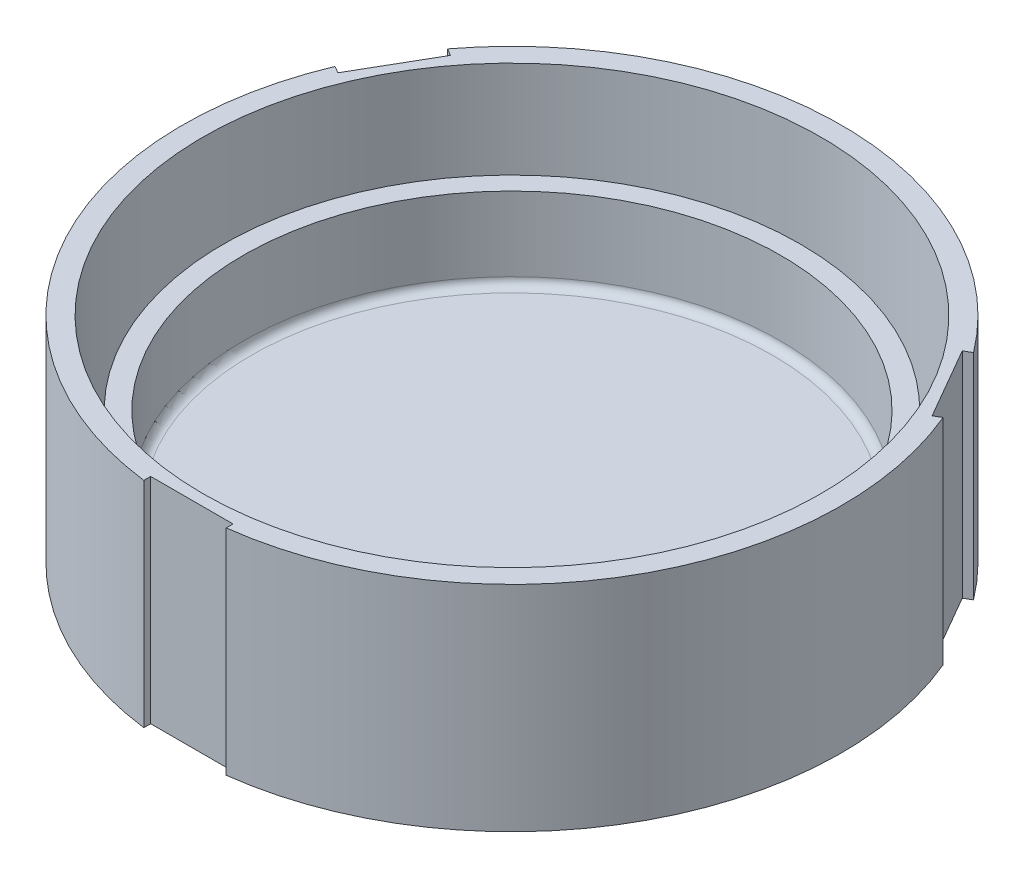
ISO-10303-21;
HEADER;
FILE_DESCRIPTION(('STEP AP214'),'2;1');
FILE_NAME('part.step','',(''),(''),'','','');
FILE_SCHEMA(('AUTOMOTIVE_DESIGN { 1 0 10303 214 1 1 1 1 }'));
ENDSEC;
DATA;
#1=APPLICATION_CONTEXT('core data for automotive mechanical design processes');
#2=APPLICATION_PROTOCOL_DEFINITION('international standard','automotive_design',2000,#1);
#3=PRODUCT_CONTEXT('',#1,'mechanical');
#4=PRODUCT('Part','Part','',(#3));
#5=PRODUCT_RELATED_PRODUCT_CATEGORY('part','',(#4));
#6=PRODUCT_DEFINITION_FORMATION('','',#4);
#7=PRODUCT_DEFINITION_CONTEXT('part definition',#1,'design');
#8=PRODUCT_DEFINITION('design','',#6,#7);
#9=PRODUCT_DEFINITION_SHAPE('','',#8);
#10=(LENGTH_UNIT() NAMED_UNIT(*) SI_UNIT(.MILLI.,.METRE.));
#11=(NAMED_UNIT(*) PLANE_ANGLE_UNIT() SI_UNIT($,.RADIAN.));
#12=(NAMED_UNIT(*) SI_UNIT($,.STERADIAN.) SOLID_ANGLE_UNIT());
#13=UNCERTAINTY_MEASURE_WITH_UNIT(LENGTH_MEASURE(1.E-05),#10,'distance_accuracy_value','');
#14=(GEOMETRIC_REPRESENTATION_CONTEXT(3) GLOBAL_UNCERTAINTY_ASSIGNED_CONTEXT((#13)) GLOBAL_UNIT_ASSIGNED_CONTEXT((#10,
#11,#12)) REPRESENTATION_CONTEXT('',''));
#15=CARTESIAN_POINT('',(0.,0.,0.));
#16=DIRECTION('',(0.,0.,1.));
#17=DIRECTION('',(1.,0.,0.));
#18=AXIS2_PLACEMENT_3D('',#15,#16,#17);
#19=CARTESIAN_POINT('',(0.,52.,0.));
#20=DIRECTION('',(0.,-1.,0.));
#21=DIRECTION('',(0.,0.,-1.));
#22=AXIS2_PLACEMENT_3D('',#19,#20,#21);
#23=CYLINDRICAL_SURFACE('',#22,80.);
#24=DIRECTION('',(0.,-1.,0.));
#25=VECTOR('',#24,1.);
#26=CARTESIAN_POINT('',(73.8095416006991,52.,-30.8569533281345));
#27=LINE('',#26,#25);
#28=CARTESIAN_POINT('',(73.8095416006991,52.,-30.8569533281345));
#29=VERTEX_POINT('',#28);
#30=CARTESIAN_POINT('',(73.8095416006991,0.,-30.8569533281345));
#31=VERTEX_POINT('',#30);
#32=EDGE_CURVE('E301',#29,#31,#27,.T.);
#33=ORIENTED_EDGE('',*,*,#32,.F.);
#34=CARTESIAN_POINT('',(0.,52.,0.));
#35=DIRECTION('',(0.,1.,0.));
#36=DIRECTION('',(0.,0.,1.));
#37=AXIS2_PLACEMENT_3D('',#34,#35,#36);
#38=CIRCLE('',#37,80.);
#39=CARTESIAN_POINT('',(10.0000000000001,52.,79.3725393319377));
#40=VERTEX_POINT('',#39);
#41=EDGE_CURVE('E317',#40,#29,#38,.T.);
#42=ORIENTED_EDGE('',*,*,#41,.F.);
#43=DIRECTION('',(0.,-1.,0.));
#44=VECTOR('',#43,1.);
#45=CARTESIAN_POINT('',(10.0000000000001,52.,79.3725393319377));
#46=LINE('',#45,#44);
#47=CARTESIAN_POINT('',(10.0000000000001,0.,79.3725393319377));
#48=VERTEX_POINT('',#47);
#49=EDGE_CURVE('E292',#40,#48,#46,.T.);
#50=ORIENTED_EDGE('',*,*,#49,.T.);
#51=CARTESIAN_POINT('',(0.,0.,0.));
#52=DIRECTION('',(0.,1.,0.));
#53=DIRECTION('',(0.,0.,1.));
#54=AXIS2_PLACEMENT_3D('',#51,#52,#53);
#55=CIRCLE('',#54,80.);
#56=EDGE_CURVE('E323',#48,#31,#55,.T.);
#57=ORIENTED_EDGE('',*,*,#56,.T.);
#58=EDGE_LOOP('',(#33,#42,#50,#57));
#59=FACE_BOUND('',#58,.T.);
#60=ADVANCED_FACE('F105',(#59),#23,.T.);
#61=DIRECTION('',(0.,-1.,0.));
#62=VECTOR('',#61,1.);
#63=CARTESIAN_POINT('',(-9.99999999999604,52.,79.3725393319382));
#64=LINE('',#63,#62);
#65=CARTESIAN_POINT('',(-9.99999999999604,52.,79.3725393319382));
#66=VERTEX_POINT('',#65);
#67=CARTESIAN_POINT('',(-9.99999999999604,0.,79.3725393319382));
#68=VERTEX_POINT('',#67);
#69=EDGE_CURVE('E296',#66,#68,#64,.T.);
#70=ORIENTED_EDGE('',*,*,#69,.F.);
#71=CARTESIAN_POINT('',(-73.8095416006981,52.,-30.8569533281368));
#72=VERTEX_POINT('',#71);
#73=EDGE_CURVE('E322',#72,#66,#38,.T.);
#74=ORIENTED_EDGE('',*,*,#73,.F.);
#75=DIRECTION('',(0.,-1.,0.));
#76=VECTOR('',#75,1.);
#77=CARTESIAN_POINT('',(-73.8095416006981,52.,-30.8569533281368));
#78=LINE('',#77,#76);
#79=CARTESIAN_POINT('',(-73.8095416006981,0.,-30.8569533281368));
#80=VERTEX_POINT('',#79);
#81=EDGE_CURVE('E206',#72,#80,#78,.T.);
#82=ORIENTED_EDGE('',*,*,#81,.T.);
#83=EDGE_CURVE('E316',#80,#68,#55,.T.);
#84=ORIENTED_EDGE('',*,*,#83,.T.);
#85=EDGE_LOOP('',(#70,#74,#82,#84));
#86=FACE_BOUND('',#85,.T.);
#87=ADVANCED_FACE('F390',(#86),#23,.T.);
#88=CARTESIAN_POINT('',(63.8492279761977,52.,-48.2003743433963));
#89=VERTEX_POINT('',#88);
#90=CARTESIAN_POINT('',(-63.8492279761963,52.,-48.2003743433982));
#91=VERTEX_POINT('',#90);
#92=EDGE_CURVE('E321',#89,#91,#38,.T.);
#93=ORIENTED_EDGE('',*,*,#92,.F.);
#94=DIRECTION('',(0.,-1.,0.));
#95=VECTOR('',#94,1.);
#96=CARTESIAN_POINT('',(63.8492279761977,52.,-48.2003743433962));
#97=LINE('',#96,#95);
#98=CARTESIAN_POINT('',(63.8492279761977,0.,-48.2003743433963));
#99=VERTEX_POINT('',#98);
#100=EDGE_CURVE('E200',#89,#99,#97,.T.);
#101=ORIENTED_EDGE('',*,*,#100,.T.);
#102=CARTESIAN_POINT('',(-63.8492279761963,0.,-48.2003743433982));
#103=VERTEX_POINT('',#102);
#104=EDGE_CURVE('E327',#99,#103,#55,.T.);
#105=ORIENTED_EDGE('',*,*,#104,.T.);
#106=DIRECTION('',(0.,-1.,0.));
#107=VECTOR('',#106,1.);
#108=CARTESIAN_POINT('',(-63.8492279761962,52.,-48.2003743433982));
#109=LINE('',#108,#107);
#110=EDGE_CURVE('E289',#91,#103,#109,.T.);
#111=ORIENTED_EDGE('',*,*,#110,.F.);
#112=EDGE_LOOP('',(#93,#101,#105,#111));
#113=FACE_BOUND('',#112,.T.);
#114=ADVANCED_FACE('F393',(#113),#23,.T.);
#115=CARTESIAN_POINT('',(0.,52.,0.));
#116=DIRECTION('',(0.,1.,0.));
#117=DIRECTION('',(0.,0.,1.));
#118=AXIS2_PLACEMENT_3D('',#115,#116,#117);
#119=PLANE('',#118);
#120=CARTESIAN_POINT('',(0.,52.,0.));
#121=DIRECTION('',(0.,1.,0.));
#122=DIRECTION('',(0.,0.,1.));
#123=AXIS2_PLACEMENT_3D('',#120,#121,#122);
#124=CIRCLE('',#123,75.);
#125=CARTESIAN_POINT('',(0.,52.,75.));
#126=VERTEX_POINT('',#125);
#127=EDGE_CURVE('E312',#126,#126,#124,.T.);
#128=ORIENTED_EDGE('',*,*,#127,.F.);
#129=EDGE_LOOP('',(#128));
#130=FACE_BOUND('',#129,.T.);
#131=ORIENTED_EDGE('',*,*,#41,.T.);
#132=DIRECTION('',(0.866025403784439,0.,-0.5));
#133=VECTOR('',#132,1.);
#134=CARTESIAN_POINT('',(5.09093266739714,52.,8.817754037844));
#135=LINE('',#134,#133);
#136=CARTESIAN_POINT('',(72.1169687932951,52.,-29.8797459621568));
#137=VERTEX_POINT('',#136);
#138=EDGE_CURVE('E207',#137,#29,#135,.T.);
#139=ORIENTED_EDGE('',*,*,#138,.F.);
#140=DIRECTION('',(-0.500000000000001,0.,-0.866025403784438));
#141=VECTOR('',#140,1.);
#142=CARTESIAN_POINT('',(72.1169687932951,52.,-29.8797459621568));
#143=LINE('',#142,#141);
#144=CARTESIAN_POINT('',(62.1169687932972,52.,-47.2002540378419));
#145=VERTEX_POINT('',#144);
#146=EDGE_CURVE('E210',#137,#145,#143,.T.);
#147=ORIENTED_EDGE('',*,*,#146,.T.);
#148=DIRECTION('',(0.866025403784335,0.,-0.50000000000018));
#149=VECTOR('',#148,1.);
#150=CARTESIAN_POINT('',(-4.9090673325945,52.,-8.50275403782622));
#151=LINE('',#150,#149);
#152=EDGE_CURVE('E195',#145,#89,#151,.T.);
#153=ORIENTED_EDGE('',*,*,#152,.T.);
#154=ORIENTED_EDGE('',*,*,#92,.T.);
#155=DIRECTION('',(-0.866025403784439,0.,-0.5));
#156=VECTOR('',#155,1.);
#157=CARTESIAN_POINT('',(-62.1169687932925,52.,-47.2002540378425));
#158=LINE('',#157,#156);
#159=CARTESIAN_POINT('',(-62.1169687932925,52.,-47.2002540378425));
#160=VERTEX_POINT('',#159);
#161=EDGE_CURVE('E261',#160,#91,#158,.T.);
#162=ORIENTED_EDGE('',*,*,#161,.F.);
#163=DIRECTION('',(-0.5,0.,0.866025403784439));
#164=VECTOR('',#163,1.);
#165=CARTESIAN_POINT('',(-62.1169687932925,52.,-47.2002540378425));
#166=LINE('',#165,#164);
#167=CARTESIAN_POINT('',(-72.1169687932904,52.,-29.8797459621573));
#168=VERTEX_POINT('',#167);
#169=EDGE_CURVE('E271',#160,#168,#166,.T.);
#170=ORIENTED_EDGE('',*,*,#169,.T.);
#171=DIRECTION('',(-0.866025403784543,0.,-0.49999999999982));
#172=VECTOR('',#171,1.);
#173=CARTESIAN_POINT('',(-72.1169687932904,52.,-29.8797459621573));
#174=LINE('',#173,#172);
#175=EDGE_CURVE('E279',#168,#72,#174,.T.);
#176=ORIENTED_EDGE('',*,*,#175,.T.);
#177=ORIENTED_EDGE('',*,*,#73,.T.);
#178=DIRECTION('',(0.,0.,1.));
#179=VECTOR('',#178,1.);
#180=CARTESIAN_POINT('',(-9.99999999999604,52.,77.71));
#181=LINE('',#180,#179);
#182=CARTESIAN_POINT('',(-9.99999999999604,52.,77.71));
#183=VERTEX_POINT('',#182);
#184=EDGE_CURVE('E234',#183,#66,#181,.T.);
#185=ORIENTED_EDGE('',*,*,#184,.F.);
#186=DIRECTION('',(1.,0.,0.));
#187=VECTOR('',#186,1.);
#188=CARTESIAN_POINT('',(-9.99999999999604,52.,77.71));
#189=LINE('',#188,#187);
#190=CARTESIAN_POINT('',(9.9999999999998,52.,77.71));
#191=VERTEX_POINT('',#190);
#192=EDGE_CURVE('E244',#183,#191,#189,.T.);
#193=ORIENTED_EDGE('',*,*,#192,.T.);
#194=DIRECTION('',(2.08253553291016E-13,0.,1.));
#195=VECTOR('',#194,1.);
#196=CARTESIAN_POINT('',(9.9999999999998,52.,77.71));
#197=LINE('',#196,#195);
#198=EDGE_CURVE('E251',#191,#40,#197,.T.);
#199=ORIENTED_EDGE('',*,*,#198,.T.);
#200=EDGE_LOOP('',(#131,#139,#147,#153,#154,#162,#170,#176,#177,#185,#193,#199));
#201=FACE_BOUND('',#200,.T.);
#202=ADVANCED_FACE('F218',(#130,#201),#119,.T.);
#203=CARTESIAN_POINT('',(0.,0.,0.));
#204=DIRECTION('',(0.,1.,0.));
#205=DIRECTION('',(0.,0.,1.));
#206=AXIS2_PLACEMENT_3D('',#203,#204,#205);
#207=PLANE('',#206);
#208=DIRECTION('',(0.866025403784439,0.,-0.5));
#209=VECTOR('',#208,1.);
#210=CARTESIAN_POINT('',(5.09093266739714,0.,8.817754037844));
#211=LINE('',#210,#209);
#212=CARTESIAN_POINT('',(72.1169687932951,0.,-29.8797459621568));
#213=VERTEX_POINT('',#212);
#214=EDGE_CURVE('E229',#213,#31,#211,.T.);
#215=ORIENTED_EDGE('',*,*,#214,.T.);
#216=ORIENTED_EDGE('',*,*,#56,.F.);
#217=DIRECTION('',(2.08253553291016E-13,0.,1.));
#218=VECTOR('',#217,1.);
#219=CARTESIAN_POINT('',(9.9999999999998,0.,77.71));
#220=LINE('',#219,#218);
#221=CARTESIAN_POINT('',(9.9999999999998,0.,77.71));
#222=VERTEX_POINT('',#221);
#223=EDGE_CURVE('E243',#222,#48,#220,.T.);
#224=ORIENTED_EDGE('',*,*,#223,.F.);
#225=DIRECTION('',(1.,0.,0.));
#226=VECTOR('',#225,1.);
#227=CARTESIAN_POINT('',(-9.99999999999604,0.,77.71));
#228=LINE('',#227,#226);
#229=CARTESIAN_POINT('',(-9.99999999999604,0.,77.71));
#230=VERTEX_POINT('',#229);
#231=EDGE_CURVE('E129',#230,#222,#228,.T.);
#232=ORIENTED_EDGE('',*,*,#231,.F.);
#233=DIRECTION('',(0.,0.,1.));
#234=VECTOR('',#233,1.);
#235=CARTESIAN_POINT('',(-9.99999999999604,0.,77.71));
#236=LINE('',#235,#234);
#237=EDGE_CURVE('E239',#230,#68,#236,.T.);
#238=ORIENTED_EDGE('',*,*,#237,.T.);
#239=ORIENTED_EDGE('',*,*,#83,.F.);
#240=DIRECTION('',(-0.866025403784543,0.,-0.49999999999982));
#241=VECTOR('',#240,1.);
#242=CARTESIAN_POINT('',(-72.1169687932904,0.,-29.8797459621573));
#243=LINE('',#242,#241);
#244=CARTESIAN_POINT('',(-72.1169687932904,0.,-29.8797459621573));
#245=VERTEX_POINT('',#244);
#246=EDGE_CURVE('E270',#245,#80,#243,.T.);
#247=ORIENTED_EDGE('',*,*,#246,.F.);
#248=DIRECTION('',(-0.5,0.,0.866025403784439));
#249=VECTOR('',#248,1.);
#250=CARTESIAN_POINT('',(-62.1169687932925,0.,-47.2002540378425));
#251=LINE('',#250,#249);
#252=CARTESIAN_POINT('',(-62.1169687932925,0.,-47.2002540378425));
#253=VERTEX_POINT('',#252);
#254=EDGE_CURVE('E238',#253,#245,#251,.T.);
#255=ORIENTED_EDGE('',*,*,#254,.F.);
#256=DIRECTION('',(-0.866025403784439,0.,-0.5));
#257=VECTOR('',#256,1.);
#258=CARTESIAN_POINT('',(-62.1169687932925,0.,-47.2002540378425));
#259=LINE('',#258,#257);
#260=EDGE_CURVE('E266',#253,#103,#259,.T.);
#261=ORIENTED_EDGE('',*,*,#260,.T.);
#262=ORIENTED_EDGE('',*,*,#104,.F.);
#263=DIRECTION('',(0.866025403784335,0.,-0.50000000000018));
#264=VECTOR('',#263,1.);
#265=CARTESIAN_POINT('',(-4.9090673325945,0.,-8.50275403782622));
#266=LINE('',#265,#264);
#267=CARTESIAN_POINT('',(62.1169687932972,0.,-47.2002540378419));
#268=VERTEX_POINT('',#267);
#269=EDGE_CURVE('E225',#268,#99,#266,.T.);
#270=ORIENTED_EDGE('',*,*,#269,.F.);
#271=DIRECTION('',(-0.500000000000001,0.,-0.866025403784438));
#272=VECTOR('',#271,1.);
#273=CARTESIAN_POINT('',(72.1169687932951,0.,-29.8797459621568));
#274=LINE('',#273,#272);
#275=EDGE_CURVE('E213',#213,#268,#274,.T.);
#276=ORIENTED_EDGE('',*,*,#275,.F.);
#277=EDGE_LOOP('',(#215,#216,#224,#232,#238,#239,#247,#255,#261,#262,#270,#276));
#278=FACE_BOUND('',#277,.T.);
#279=ADVANCED_FACE('F406',(#278),#207,.F.);
#280=CARTESIAN_POINT('',(0.,12.,0.));
#281=DIRECTION('',(0.,1.,0.));
#282=DIRECTION('',(0.,0.,1.));
#283=AXIS2_PLACEMENT_3D('',#280,#281,#282);
#284=CYLINDRICAL_SURFACE('',#283,75.);
#285=CARTESIAN_POINT('',(0.,14.,0.));
#286=DIRECTION('',(0.,1.,0.));
#287=DIRECTION('',(0.,0.,1.));
#288=AXIS2_PLACEMENT_3D('',#285,#286,#287);
#289=CIRCLE('',#288,75.);
#290=CARTESIAN_POINT('',(0.,14.,75.));
#291=VERTEX_POINT('',#290);
#292=EDGE_CURVE('E114',#291,#291,#289,.F.);
#293=ORIENTED_EDGE('',*,*,#292,.T.);
#294=EDGE_LOOP('',(#293));
#295=FACE_BOUND('',#294,.T.);
#296=ORIENTED_EDGE('',*,*,#127,.T.);
#297=EDGE_LOOP('',(#296));
#298=FACE_BOUND('',#297,.T.);
#299=ADVANCED_FACE('F347',(#295,#298),#284,.F.);
#300=CARTESIAN_POINT('',(0.,12.,0.));
#301=DIRECTION('',(0.,1.,0.));
#302=DIRECTION('',(0.,0.,1.));
#303=AXIS2_PLACEMENT_3D('',#300,#301,#302);
#304=PLANE('',#303);
#305=CARTESIAN_POINT('',(0.,12.,0.));
#306=DIRECTION('',(0.,1.,0.));
#307=DIRECTION('',(0.,0.,1.));
#308=AXIS2_PLACEMENT_3D('',#305,#306,#307);
#309=CIRCLE('',#308,73.);
#310=CARTESIAN_POINT('',(0.,12.,73.));
#311=VERTEX_POINT('',#310);
#312=EDGE_CURVE('E339',#311,#311,#309,.T.);
#313=ORIENTED_EDGE('',*,*,#312,.T.);
#314=EDGE_LOOP('',(#313));
#315=FACE_BOUND('',#314,.T.);
#316=CARTESIAN_POINT('',(0.,12.,0.));
#317=DIRECTION('',(0.,1.,0.));
#318=DIRECTION('',(0.,0.,1.));
#319=AXIS2_PLACEMENT_3D('',#316,#317,#318);
#320=CIRCLE('',#319,72.);
#321=CARTESIAN_POINT('',(0.,12.,72.));
#322=VERTEX_POINT('',#321);
#323=EDGE_CURVE('E335',#322,#322,#320,.F.);
#324=ORIENTED_EDGE('',*,*,#323,.T.);
#325=EDGE_LOOP('',(#324));
#326=FACE_BOUND('',#325,.T.);
#327=ADVANCED_FACE('F356',(#315,#326),#304,.T.);
#328=CARTESIAN_POINT('',(0.,32.,0.));
#329=DIRECTION('',(0.,1.,0.));
#330=DIRECTION('',(0.,0.,1.));
#331=AXIS2_PLACEMENT_3D('',#328,#329,#330);
#332=PLANE('',#331);
#333=CARTESIAN_POINT('',(0.,32.,0.));
#334=DIRECTION('',(0.,1.,0.));
#335=DIRECTION('',(0.,0.,1.));
#336=AXIS2_PLACEMENT_3D('',#333,#334,#335);
#337=CIRCLE('',#336,70.);
#338=CARTESIAN_POINT('',(0.,32.,70.));
#339=VERTEX_POINT('',#338);
#340=EDGE_CURVE('E308',#339,#339,#337,.T.);
#341=ORIENTED_EDGE('',*,*,#340,.T.);
#342=EDGE_LOOP('',(#341));
#343=FACE_BOUND('',#342,.T.);
#344=CARTESIAN_POINT('',(0.,32.,0.));
#345=DIRECTION('',(0.,1.,0.));
#346=DIRECTION('',(0.,0.,1.));
#347=AXIS2_PLACEMENT_3D('',#344,#345,#346);
#348=CIRCLE('',#347,65.25);
#349=CARTESIAN_POINT('',(0.,32.,65.25));
#350=VERTEX_POINT('',#349);
#351=EDGE_CURVE('E304',#350,#350,#348,.T.);
#352=ORIENTED_EDGE('',*,*,#351,.F.);
#353=EDGE_LOOP('',(#352));
#354=FACE_BOUND('',#353,.T.);
#355=ADVANCED_FACE('F359',(#343,#354),#332,.T.);
#356=CARTESIAN_POINT('',(0.,32.,0.));
#357=DIRECTION('',(0.,-1.,0.));
#358=DIRECTION('',(0.,0.,-1.));
#359=AXIS2_PLACEMENT_3D('',#356,#357,#358);
#360=CYLINDRICAL_SURFACE('',#359,70.);
#361=CARTESIAN_POINT('',(0.,14.,0.));
#362=DIRECTION('',(0.,1.,0.));
#363=DIRECTION('',(0.,0.,1.));
#364=AXIS2_PLACEMENT_3D('',#361,#362,#363);
#365=CIRCLE('',#364,70.);
#366=CARTESIAN_POINT('',(0.,14.,70.));
#367=VERTEX_POINT('',#366);
#368=EDGE_CURVE('E14',#367,#367,#365,.T.);
#369=ORIENTED_EDGE('',*,*,#368,.T.);
#370=EDGE_LOOP('',(#369));
#371=FACE_BOUND('',#370,.T.);
#372=ORIENTED_EDGE('',*,*,#340,.F.);
#373=EDGE_LOOP('',(#372));
#374=FACE_BOUND('',#373,.T.);
#375=ADVANCED_FACE('F369',(#371,#374),#360,.T.);
#376=CARTESIAN_POINT('',(0.,32.,0.));
#377=DIRECTION('',(0.,-1.,0.));
#378=DIRECTION('',(0.,0.,-1.));
#379=AXIS2_PLACEMENT_3D('',#376,#377,#378);
#380=CYLINDRICAL_SURFACE('',#379,65.25);
#381=CARTESIAN_POINT('',(0.,14.,0.));
#382=DIRECTION('',(0.,1.,0.));
#383=DIRECTION('',(0.,0.,1.));
#384=AXIS2_PLACEMENT_3D('',#381,#382,#383);
#385=CIRCLE('',#384,65.25);
#386=CARTESIAN_POINT('',(0.,14.,65.25));
#387=VERTEX_POINT('',#386);
#388=EDGE_CURVE('E320',#387,#387,#385,.F.);
#389=ORIENTED_EDGE('',*,*,#388,.T.);
#390=EDGE_LOOP('',(#389));
#391=FACE_BOUND('',#390,.T.);
#392=ORIENTED_EDGE('',*,*,#351,.T.);
#393=EDGE_LOOP('',(#392));
#394=FACE_BOUND('',#393,.T.);
#395=ADVANCED_FACE('F372',(#391,#394),#380,.F.);
#396=CARTESIAN_POINT('',(0.,12.,0.));
#397=DIRECTION('',(0.,1.,0.));
#398=DIRECTION('',(0.,0.,1.));
#399=AXIS2_PLACEMENT_3D('',#396,#397,#398);
#400=CIRCLE('',#399,63.25);
#401=CARTESIAN_POINT('',(0.,12.,63.25));
#402=VERTEX_POINT('',#401);
#403=EDGE_CURVE('E331',#402,#402,#400,.T.);
#404=ORIENTED_EDGE('',*,*,#403,.T.);
#405=EDGE_LOOP('',(#404));
#406=FACE_BOUND('',#405,.T.);
#407=ADVANCED_FACE('F361',(#406),#304,.T.);
#408=CARTESIAN_POINT('',(0.,14.,0.));
#409=DIRECTION('',(0.,1.,0.));
#410=DIRECTION('',(0.,0.,1.));
#411=AXIS2_PLACEMENT_3D('',#408,#409,#410);
#412=TOROIDAL_SURFACE('',#411,63.25,2.);
#413=ORIENTED_EDGE('',*,*,#403,.F.);
#414=EDGE_LOOP('',(#413));
#415=FACE_BOUND('',#414,.T.);
#416=ORIENTED_EDGE('',*,*,#388,.F.);
#417=EDGE_LOOP('',(#416));
#418=FACE_BOUND('',#417,.T.);
#419=ADVANCED_FACE('F353',(#415,#418),#412,.F.);
#420=CARTESIAN_POINT('',(0.,14.,0.));
#421=DIRECTION('',(0.,1.,0.));
#422=DIRECTION('',(0.,0.,1.));
#423=AXIS2_PLACEMENT_3D('',#420,#421,#422);
#424=TOROIDAL_SURFACE('',#423,73.,2.);
#425=ORIENTED_EDGE('',*,*,#292,.F.);
#426=EDGE_LOOP('',(#425));
#427=FACE_BOUND('',#426,.T.);
#428=ORIENTED_EDGE('',*,*,#312,.F.);
#429=EDGE_LOOP('',(#428));
#430=FACE_BOUND('',#429,.T.);
#431=ADVANCED_FACE('F350',(#427,#430),#424,.F.);
#432=CARTESIAN_POINT('',(0.,14.,0.));
#433=DIRECTION('',(0.,1.,0.));
#434=DIRECTION('',(0.,0.,1.));
#435=AXIS2_PLACEMENT_3D('',#432,#433,#434);
#436=TOROIDAL_SURFACE('',#435,72.,2.);
#437=ORIENTED_EDGE('',*,*,#323,.F.);
#438=EDGE_LOOP('',(#437));
#439=FACE_BOUND('',#438,.T.);
#440=ORIENTED_EDGE('',*,*,#368,.F.);
#441=EDGE_LOOP('',(#440));
#442=FACE_BOUND('',#441,.T.);
#443=ADVANCED_FACE('F107',(#439,#442),#436,.F.);
#444=CARTESIAN_POINT('',(4.9090673326022,52.,-8.50275403784363));
#445=DIRECTION('',(-0.5,0.,0.866025403784438));
#446=DIRECTION('',(0.866025403784439,0.,0.5));
#447=AXIS2_PLACEMENT_3D('',#444,#445,#446);
#448=PLANE('',#447);
#449=ORIENTED_EDGE('',*,*,#110,.T.);
#450=ORIENTED_EDGE('',*,*,#260,.F.);
#451=DIRECTION('',(0.,-1.,0.));
#452=VECTOR('',#451,1.);
#453=CARTESIAN_POINT('',(-62.1169687932925,52.,-47.2002540378425));
#454=LINE('',#453,#452);
#455=EDGE_CURVE('E262',#160,#253,#454,.T.);
#456=ORIENTED_EDGE('',*,*,#455,.F.);
#457=ORIENTED_EDGE('',*,*,#161,.T.);
#458=EDGE_LOOP('',(#449,#450,#456,#457));
#459=FACE_BOUND('',#458,.T.);
#460=ADVANCED_FACE('F366',(#459),#448,.T.);
#461=CARTESIAN_POINT('',(-5.09093266738583,52.,8.81775403782865));
#462=DIRECTION('',(-0.49999999999982,0.,0.866025403784543));
#463=DIRECTION('',(0.866025403784543,0.,0.49999999999982));
#464=AXIS2_PLACEMENT_3D('',#461,#462,#463);
#465=PLANE('',#464);
#466=ORIENTED_EDGE('',*,*,#175,.F.);
#467=DIRECTION('',(0.,-1.,0.));
#468=VECTOR('',#467,1.);
#469=CARTESIAN_POINT('',(-72.1169687932904,52.,-29.8797459621573));
#470=LINE('',#469,#468);
#471=EDGE_CURVE('E258',#168,#245,#470,.T.);
#472=ORIENTED_EDGE('',*,*,#471,.T.);
#473=ORIENTED_EDGE('',*,*,#246,.T.);
#474=ORIENTED_EDGE('',*,*,#81,.F.);
#475=EDGE_LOOP('',(#466,#472,#473,#474));
#476=FACE_BOUND('',#475,.T.);
#477=ADVANCED_FACE('F455',(#476),#465,.F.);
#478=CARTESIAN_POINT('',(-62.1169687932925,52.,-47.2002540378425));
#479=DIRECTION('',(0.866025403784439,0.,0.5));
#480=DIRECTION('',(0.5,0.,-0.866025403784439));
#481=AXIS2_PLACEMENT_3D('',#478,#479,#480);
#482=PLANE('',#481);
#483=ORIENTED_EDGE('',*,*,#254,.T.);
#484=ORIENTED_EDGE('',*,*,#471,.F.);
#485=ORIENTED_EDGE('',*,*,#169,.F.);
#486=ORIENTED_EDGE('',*,*,#455,.T.);
#487=EDGE_LOOP('',(#483,#484,#485,#486));
#488=FACE_BOUND('',#487,.T.);
#489=ADVANCED_FACE('F452',(#488),#482,.F.);
#490=CARTESIAN_POINT('',(-9.99999999999604,52.,77.71));
#491=DIRECTION('',(1.,0.,0.));
#492=DIRECTION('',(0.,0.,-1.));
#493=AXIS2_PLACEMENT_3D('',#490,#491,#492);
#494=PLANE('',#493);
#495=ORIENTED_EDGE('',*,*,#69,.T.);
#496=ORIENTED_EDGE('',*,*,#237,.F.);
#497=DIRECTION('',(0.,-1.,0.));
#498=VECTOR('',#497,1.);
#499=CARTESIAN_POINT('',(-9.99999999999604,52.,77.71));
#500=LINE('',#499,#498);
#501=EDGE_CURVE('E235',#183,#230,#500,.T.);
#502=ORIENTED_EDGE('',*,*,#501,.F.);
#503=ORIENTED_EDGE('',*,*,#184,.T.);
#504=EDGE_LOOP('',(#495,#496,#502,#503));
#505=FACE_BOUND('',#504,.T.);
#506=ADVANCED_FACE('F426',(#505),#494,.T.);
#507=CARTESIAN_POINT('',(9.9999999999998,52.,77.71));
#508=DIRECTION('',(1.,0.,-2.08253553291015E-13));
#509=DIRECTION('',(-2.08253553291016E-13,0.,-1.));
#510=AXIS2_PLACEMENT_3D('',#507,#508,#509);
#511=PLANE('',#510);
#512=ORIENTED_EDGE('',*,*,#198,.F.);
#513=DIRECTION('',(0.,-1.,0.));
#514=VECTOR('',#513,1.);
#515=CARTESIAN_POINT('',(9.9999999999998,52.,77.71));
#516=LINE('',#515,#514);
#517=EDGE_CURVE('E231',#191,#222,#516,.T.);
#518=ORIENTED_EDGE('',*,*,#517,.T.);
#519=ORIENTED_EDGE('',*,*,#223,.T.);
#520=ORIENTED_EDGE('',*,*,#49,.F.);
#521=EDGE_LOOP('',(#512,#518,#519,#520));
#522=FACE_BOUND('',#521,.T.);
#523=ADVANCED_FACE('F434',(#522),#511,.F.);
#524=CARTESIAN_POINT('',(-9.99999999999604,52.,77.71));
#525=DIRECTION('',(0.,0.,-1.));
#526=DIRECTION('',(-1.,0.,0.));
#527=AXIS2_PLACEMENT_3D('',#524,#525,#526);
#528=PLANE('',#527);
#529=ORIENTED_EDGE('',*,*,#231,.T.);
#530=ORIENTED_EDGE('',*,*,#517,.F.);
#531=ORIENTED_EDGE('',*,*,#192,.F.);
#532=ORIENTED_EDGE('',*,*,#501,.T.);
#533=EDGE_LOOP('',(#529,#530,#531,#532));
#534=FACE_BOUND('',#533,.T.);
#535=ADVANCED_FACE('F437',(#534),#528,.F.);
#536=CARTESIAN_POINT('',(5.09093266739714,52.,8.817754037844));
#537=DIRECTION('',(-0.5,0.,-0.866025403784438));
#538=DIRECTION('',(-0.866025403784439,0.,0.5));
#539=AXIS2_PLACEMENT_3D('',#536,#537,#538);
#540=PLANE('',#539);
#541=ORIENTED_EDGE('',*,*,#32,.T.);
#542=ORIENTED_EDGE('',*,*,#214,.F.);
#543=DIRECTION('',(0.,-1.,0.));
#544=VECTOR('',#543,1.);
#545=CARTESIAN_POINT('',(72.1169687932951,52.,-29.8797459621568));
#546=LINE('',#545,#544);
#547=EDGE_CURVE('E121',#137,#213,#546,.T.);
#548=ORIENTED_EDGE('',*,*,#547,.F.);
#549=ORIENTED_EDGE('',*,*,#138,.T.);
#550=EDGE_LOOP('',(#541,#542,#548,#549));
#551=FACE_BOUND('',#550,.T.);
#552=ADVANCED_FACE('F439',(#551),#540,.T.);
#553=CARTESIAN_POINT('',(-4.9090673325945,52.,-8.50275403782622));
#554=DIRECTION('',(-0.50000000000018,0.,-0.866025403784335));
#555=DIRECTION('',(-0.866025403784335,0.,0.50000000000018));
#556=AXIS2_PLACEMENT_3D('',#553,#554,#555);
#557=PLANE('',#556);
#558=ORIENTED_EDGE('',*,*,#152,.F.);
#559=DIRECTION('',(0.,-1.,0.));
#560=VECTOR('',#559,1.);
#561=CARTESIAN_POINT('',(62.1169687932972,52.,-47.2002540378419));
#562=LINE('',#561,#560);
#563=EDGE_CURVE('E198',#145,#268,#562,.T.);
#564=ORIENTED_EDGE('',*,*,#563,.T.);
#565=ORIENTED_EDGE('',*,*,#269,.T.);
#566=ORIENTED_EDGE('',*,*,#100,.F.);
#567=EDGE_LOOP('',(#558,#564,#565,#566));
#568=FACE_BOUND('',#567,.T.);
#569=ADVANCED_FACE('F197',(#568),#557,.F.);
#570=CARTESIAN_POINT('',(72.1169687932951,52.,-29.8797459621568));
#571=DIRECTION('',(-0.866025403784438,0.,0.500000000000001));
#572=DIRECTION('',(0.500000000000001,0.,0.866025403784438));
#573=AXIS2_PLACEMENT_3D('',#570,#571,#572);
#574=PLANE('',#573);
#575=ORIENTED_EDGE('',*,*,#275,.T.);
#576=ORIENTED_EDGE('',*,*,#563,.F.);
#577=ORIENTED_EDGE('',*,*,#146,.F.);
#578=ORIENTED_EDGE('',*,*,#547,.T.);
#579=EDGE_LOOP('',(#575,#576,#577,#578));
#580=FACE_BOUND('',#579,.T.);
#581=ADVANCED_FACE('F209',(#580),#574,.F.);
#582=CLOSED_SHELL('',(#60,#87,#114,#202,#279,#299,#327,#355,#375,#395,#407,#419,#431,#443,#460,
#477,#489,#506,#523,#535,#552,#569,#581));
#583=MANIFOLD_SOLID_BREP('B2',#582);
#584=ADVANCED_BREP_SHAPE_REPRESENTATION('',(#18,#583),#14);
#585=SHAPE_DEFINITION_REPRESENTATION(#9,#584);
ENDSEC;
END-ISO-10303-21;
